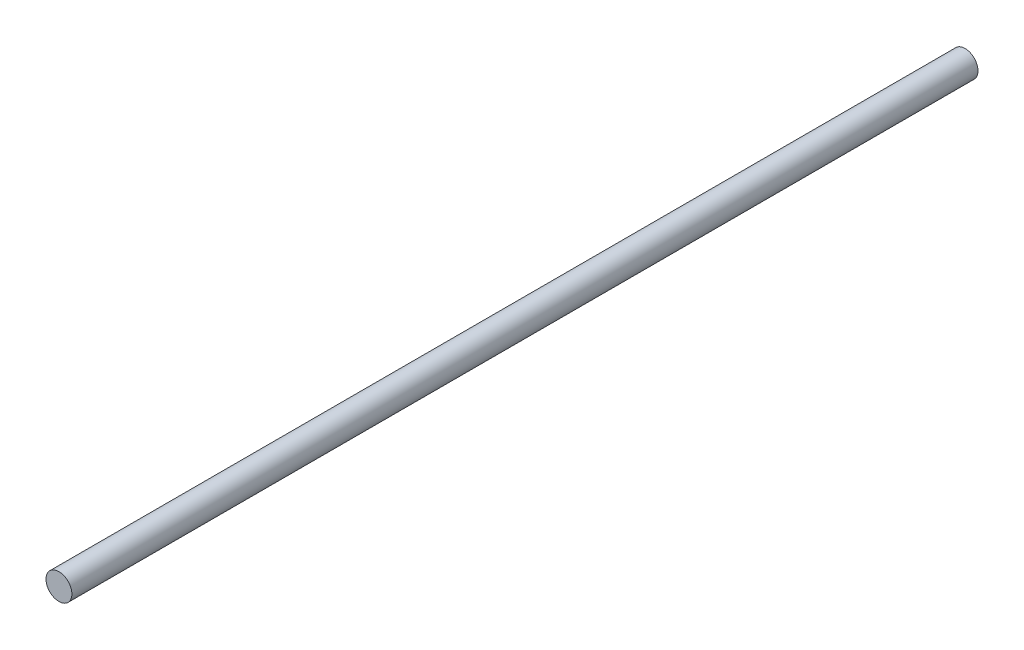
ISO-10303-21;
HEADER;
FILE_DESCRIPTION(('STEP AP214'),'2;1');
FILE_NAME('part.step','',(''),(''),'','','');
FILE_SCHEMA(('AUTOMOTIVE_DESIGN { 1 0 10303 214 1 1 1 1 }'));
ENDSEC;
DATA;
#1=APPLICATION_CONTEXT('core data for automotive mechanical design processes');
#2=APPLICATION_PROTOCOL_DEFINITION('international standard','automotive_design',2000,#1);
#3=PRODUCT_CONTEXT('',#1,'mechanical');
#4=PRODUCT('Part','Part','',(#3));
#5=PRODUCT_RELATED_PRODUCT_CATEGORY('part','',(#4));
#6=PRODUCT_DEFINITION_FORMATION('','',#4);
#7=PRODUCT_DEFINITION_CONTEXT('part definition',#1,'design');
#8=PRODUCT_DEFINITION('design','',#6,#7);
#9=PRODUCT_DEFINITION_SHAPE('','',#8);
#10=(LENGTH_UNIT() NAMED_UNIT(*) SI_UNIT(.MILLI.,.METRE.));
#11=(NAMED_UNIT(*) PLANE_ANGLE_UNIT() SI_UNIT($,.RADIAN.));
#12=(NAMED_UNIT(*) SI_UNIT($,.STERADIAN.) SOLID_ANGLE_UNIT());
#13=UNCERTAINTY_MEASURE_WITH_UNIT(LENGTH_MEASURE(1.E-05),#10,'distance_accuracy_value','');
#14=(GEOMETRIC_REPRESENTATION_CONTEXT(3) GLOBAL_UNCERTAINTY_ASSIGNED_CONTEXT((#13)) GLOBAL_UNIT_ASSIGNED_CONTEXT((#10,
#11,#12)) REPRESENTATION_CONTEXT('',''));
#15=CARTESIAN_POINT('',(0.,0.,0.));
#16=DIRECTION('',(0.,0.,1.));
#17=DIRECTION('',(1.,0.,0.));
#18=AXIS2_PLACEMENT_3D('',#15,#16,#17);
#19=CARTESIAN_POINT('',(0.,0.,280.));
#20=DIRECTION('',(0.,0.,-1.));
#21=DIRECTION('',(-1.,0.,0.));
#22=AXIS2_PLACEMENT_3D('',#19,#20,#21);
#23=CYLINDRICAL_SURFACE('',#22,4.);
#24=CARTESIAN_POINT('',(0.,0.,280.));
#25=DIRECTION('',(0.,0.,1.));
#26=DIRECTION('',(1.,0.,0.));
#27=AXIS2_PLACEMENT_3D('',#24,#25,#26);
#28=CIRCLE('',#27,4.);
#29=CARTESIAN_POINT('',(4.,0.,280.));
#30=VERTEX_POINT('',#29);
#31=EDGE_CURVE('E10',#30,#30,#28,.T.);
#32=ORIENTED_EDGE('',*,*,#31,.F.);
#33=EDGE_LOOP('',(#32));
#34=FACE_BOUND('',#33,.T.);
#35=CARTESIAN_POINT('',(0.,0.,0.));
#36=DIRECTION('',(0.,0.,1.));
#37=DIRECTION('',(1.,0.,0.));
#38=AXIS2_PLACEMENT_3D('',#35,#36,#37);
#39=CIRCLE('',#38,4.);
#40=CARTESIAN_POINT('',(4.,0.,0.));
#41=VERTEX_POINT('',#40);
#42=EDGE_CURVE('E38',#41,#41,#39,.T.);
#43=ORIENTED_EDGE('',*,*,#42,.T.);
#44=EDGE_LOOP('',(#43));
#45=FACE_BOUND('',#44,.T.);
#46=ADVANCED_FACE('F35',(#34,#45),#23,.T.);
#47=CARTESIAN_POINT('',(0.,0.,280.));
#48=DIRECTION('',(0.,0.,1.));
#49=DIRECTION('',(1.,0.,0.));
#50=AXIS2_PLACEMENT_3D('',#47,#48,#49);
#51=PLANE('',#50);
#52=ORIENTED_EDGE('',*,*,#31,.T.);
#53=EDGE_LOOP('',(#52));
#54=FACE_BOUND('',#53,.T.);
#55=ADVANCED_FACE('F50',(#54),#51,.T.);
#56=CARTESIAN_POINT('',(0.,0.,0.));
#57=DIRECTION('',(0.,0.,1.));
#58=DIRECTION('',(1.,0.,0.));
#59=AXIS2_PLACEMENT_3D('',#56,#57,#58);
#60=PLANE('',#59);
#61=ORIENTED_EDGE('',*,*,#42,.F.);
#62=EDGE_LOOP('',(#61));
#63=FACE_BOUND('',#62,.T.);
#64=ADVANCED_FACE('F48',(#63),#60,.F.);
#65=CLOSED_SHELL('',(#46,#55,#64));
#66=MANIFOLD_SOLID_BREP('B2',#65);
#67=ADVANCED_BREP_SHAPE_REPRESENTATION('',(#18,#66),#14);
#68=SHAPE_DEFINITION_REPRESENTATION(#9,#67);
ENDSEC;
END-ISO-10303-21;
